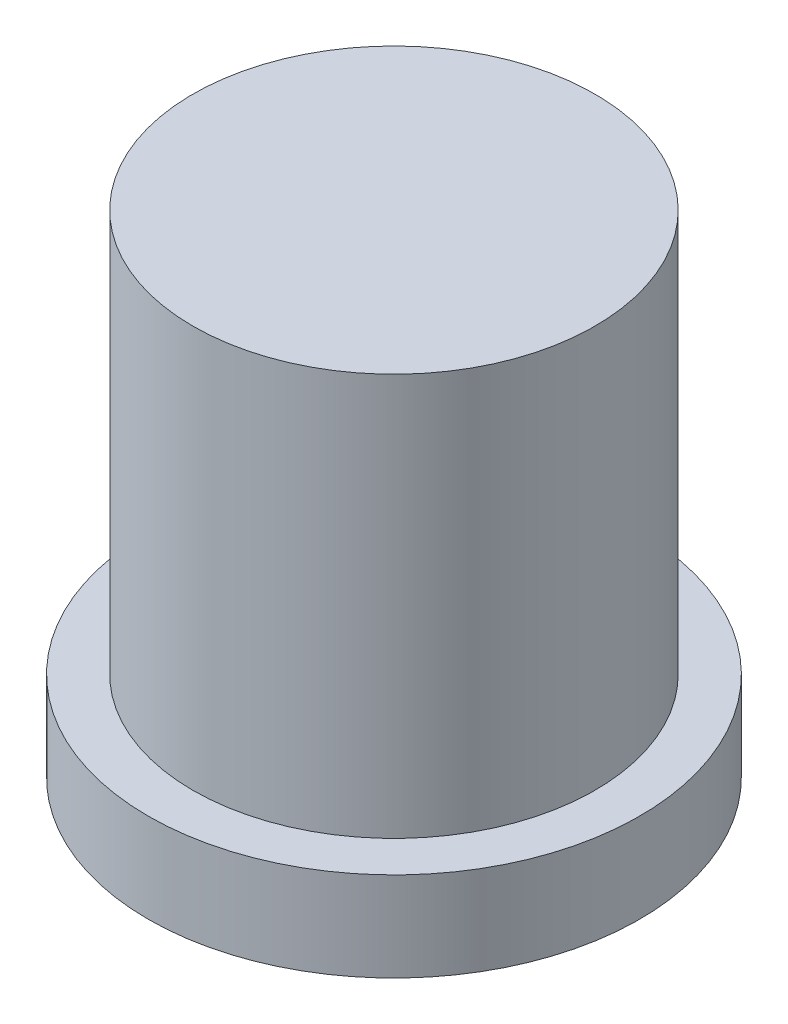
ISO-10303-21;
HEADER;
FILE_DESCRIPTION(('STEP AP214'),'2;1');
FILE_NAME('part.step','',(''),(''),'','','');
FILE_SCHEMA(('AUTOMOTIVE_DESIGN { 1 0 10303 214 1 1 1 1 }'));
ENDSEC;
DATA;
#1=APPLICATION_CONTEXT('core data for automotive mechanical design processes');
#2=APPLICATION_PROTOCOL_DEFINITION('international standard','automotive_design',2000,#1);
#3=PRODUCT_CONTEXT('',#1,'mechanical');
#4=PRODUCT('Part','Part','',(#3));
#5=PRODUCT_RELATED_PRODUCT_CATEGORY('part','',(#4));
#6=PRODUCT_DEFINITION_FORMATION('','',#4);
#7=PRODUCT_DEFINITION_CONTEXT('part definition',#1,'design');
#8=PRODUCT_DEFINITION('design','',#6,#7);
#9=PRODUCT_DEFINITION_SHAPE('','',#8);
#10=(LENGTH_UNIT() NAMED_UNIT(*) SI_UNIT(.MILLI.,.METRE.));
#11=(NAMED_UNIT(*) PLANE_ANGLE_UNIT() SI_UNIT($,.RADIAN.));
#12=(NAMED_UNIT(*) SI_UNIT($,.STERADIAN.) SOLID_ANGLE_UNIT());
#13=UNCERTAINTY_MEASURE_WITH_UNIT(LENGTH_MEASURE(1.E-05),#10,'distance_accuracy_value','');
#14=(GEOMETRIC_REPRESENTATION_CONTEXT(3) GLOBAL_UNCERTAINTY_ASSIGNED_CONTEXT((#13)) GLOBAL_UNIT_ASSIGNED_CONTEXT((#10,
#11,#12)) REPRESENTATION_CONTEXT('',''));
#15=CARTESIAN_POINT('',(0.,0.,0.));
#16=DIRECTION('',(0.,0.,1.));
#17=DIRECTION('',(1.,0.,0.));
#18=AXIS2_PLACEMENT_3D('',#15,#16,#17);
#19=CARTESIAN_POINT('',(0.,12.7,0.));
#20=DIRECTION('',(0.,-1.,0.));
#21=DIRECTION('',(0.,0.,-1.));
#22=AXIS2_PLACEMENT_3D('',#19,#20,#21);
#23=CYLINDRICAL_SURFACE('',#22,34.925);
#24=CARTESIAN_POINT('',(0.,12.7,0.));
#25=DIRECTION('',(0.,1.,0.));
#26=DIRECTION('',(0.,0.,1.));
#27=AXIS2_PLACEMENT_3D('',#24,#25,#26);
#28=CIRCLE('',#27,34.925);
#29=CARTESIAN_POINT('',(0.,12.7,34.925));
#30=VERTEX_POINT('',#29);
#31=EDGE_CURVE('E51',#30,#30,#28,.T.);
#32=ORIENTED_EDGE('',*,*,#31,.F.);
#33=EDGE_LOOP('',(#32));
#34=FACE_BOUND('',#33,.T.);
#35=CARTESIAN_POINT('',(0.,0.,0.));
#36=DIRECTION('',(0.,1.,0.));
#37=DIRECTION('',(0.,0.,1.));
#38=AXIS2_PLACEMENT_3D('',#35,#36,#37);
#39=CIRCLE('',#38,34.925);
#40=CARTESIAN_POINT('',(0.,0.,34.925));
#41=VERTEX_POINT('',#40);
#42=EDGE_CURVE('E46',#41,#41,#39,.T.);
#43=ORIENTED_EDGE('',*,*,#42,.T.);
#44=EDGE_LOOP('',(#43));
#45=FACE_BOUND('',#44,.T.);
#46=ADVANCED_FACE('F43',(#34,#45),#23,.T.);
#47=CARTESIAN_POINT('',(0.,12.7,0.));
#48=DIRECTION('',(0.,1.,0.));
#49=DIRECTION('',(0.,0.,1.));
#50=AXIS2_PLACEMENT_3D('',#47,#48,#49);
#51=PLANE('',#50);
#52=CARTESIAN_POINT('',(0.,12.7,0.));
#53=DIRECTION('',(0.,1.,0.));
#54=DIRECTION('',(0.,0.,1.));
#55=AXIS2_PLACEMENT_3D('',#52,#53,#54);
#56=CIRCLE('',#55,28.575);
#57=CARTESIAN_POINT('',(0.,12.7,28.575));
#58=VERTEX_POINT('',#57);
#59=EDGE_CURVE('E10',#58,#58,#56,.T.);
#60=ORIENTED_EDGE('',*,*,#59,.F.);
#61=EDGE_LOOP('',(#60));
#62=FACE_BOUND('',#61,.T.);
#63=ORIENTED_EDGE('',*,*,#31,.T.);
#64=EDGE_LOOP('',(#63));
#65=FACE_BOUND('',#64,.T.);
#66=ADVANCED_FACE('F71',(#62,#65),#51,.T.);
#67=CARTESIAN_POINT('',(0.,0.,0.));
#68=DIRECTION('',(0.,1.,0.));
#69=DIRECTION('',(0.,0.,1.));
#70=AXIS2_PLACEMENT_3D('',#67,#68,#69);
#71=PLANE('',#70);
#72=ORIENTED_EDGE('',*,*,#42,.F.);
#73=EDGE_LOOP('',(#72));
#74=FACE_BOUND('',#73,.T.);
#75=ADVANCED_FACE('F68',(#74),#71,.F.);
#76=CARTESIAN_POINT('',(0.,69.85,0.));
#77=DIRECTION('',(0.,-1.,0.));
#78=DIRECTION('',(0.,0.,-1.));
#79=AXIS2_PLACEMENT_3D('',#76,#77,#78);
#80=CYLINDRICAL_SURFACE('',#79,28.575);
#81=CARTESIAN_POINT('',(0.,69.85,0.));
#82=DIRECTION('',(0.,1.,0.));
#83=DIRECTION('',(0.,0.,1.));
#84=AXIS2_PLACEMENT_3D('',#81,#82,#83);
#85=CIRCLE('',#84,28.575);
#86=CARTESIAN_POINT('',(0.,69.85,28.575));
#87=VERTEX_POINT('',#86);
#88=EDGE_CURVE('E58',#87,#87,#85,.T.);
#89=ORIENTED_EDGE('',*,*,#88,.F.);
#90=EDGE_LOOP('',(#89));
#91=FACE_BOUND('',#90,.T.);
#92=ORIENTED_EDGE('',*,*,#59,.T.);
#93=EDGE_LOOP('',(#92));
#94=FACE_BOUND('',#93,.T.);
#95=ADVANCED_FACE('F70',(#91,#94),#80,.T.);
#96=CARTESIAN_POINT('',(0.,69.85,0.));
#97=DIRECTION('',(0.,1.,0.));
#98=DIRECTION('',(0.,0.,1.));
#99=AXIS2_PLACEMENT_3D('',#96,#97,#98);
#100=PLANE('',#99);
#101=ORIENTED_EDGE('',*,*,#88,.T.);
#102=EDGE_LOOP('',(#101));
#103=FACE_BOUND('',#102,.T.);
#104=ADVANCED_FACE('F77',(#103),#100,.T.);
#105=CLOSED_SHELL('',(#46,#66,#75,#95,#104));
#106=MANIFOLD_SOLID_BREP('B2',#105);
#107=ADVANCED_BREP_SHAPE_REPRESENTATION('',(#18,#106),#14);
#108=SHAPE_DEFINITION_REPRESENTATION(#9,#107);
ENDSEC;
END-ISO-10303-21;
